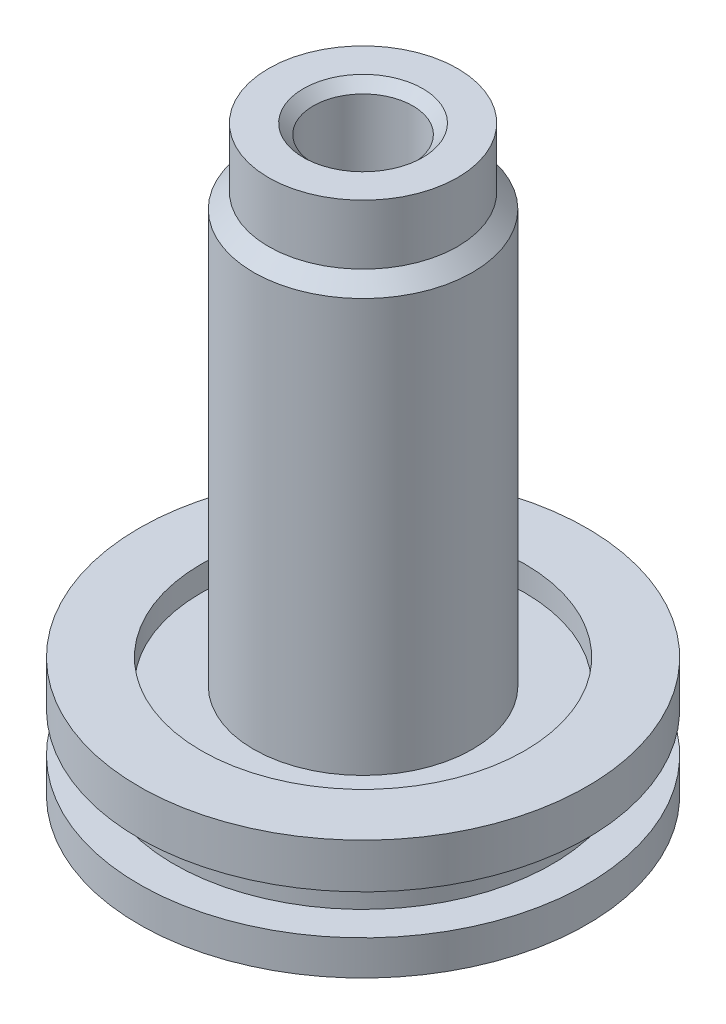
ISO-10303-21;
HEADER;
FILE_DESCRIPTION(('STEP AP214'),'2;1');
FILE_NAME('part.step','',(''),(''),'','','');
FILE_SCHEMA(('AUTOMOTIVE_DESIGN { 1 0 10303 214 1 1 1 1 }'));
ENDSEC;
DATA;
#1=APPLICATION_CONTEXT('core data for automotive mechanical design processes');
#2=APPLICATION_PROTOCOL_DEFINITION('international standard','automotive_design',2000,#1);
#3=PRODUCT_CONTEXT('',#1,'mechanical');
#4=PRODUCT('Part','Part','',(#3));
#5=PRODUCT_RELATED_PRODUCT_CATEGORY('part','',(#4));
#6=PRODUCT_DEFINITION_FORMATION('','',#4);
#7=PRODUCT_DEFINITION_CONTEXT('part definition',#1,'design');
#8=PRODUCT_DEFINITION('design','',#6,#7);
#9=PRODUCT_DEFINITION_SHAPE('','',#8);
#10=(LENGTH_UNIT() NAMED_UNIT(*) SI_UNIT(.MILLI.,.METRE.));
#11=(NAMED_UNIT(*) PLANE_ANGLE_UNIT() SI_UNIT($,.RADIAN.));
#12=(NAMED_UNIT(*) SI_UNIT($,.STERADIAN.) SOLID_ANGLE_UNIT());
#13=UNCERTAINTY_MEASURE_WITH_UNIT(LENGTH_MEASURE(1.E-05),#10,'distance_accuracy_value','');
#14=(GEOMETRIC_REPRESENTATION_CONTEXT(3) GLOBAL_UNCERTAINTY_ASSIGNED_CONTEXT((#13)) GLOBAL_UNIT_ASSIGNED_CONTEXT((#10,
#11,#12)) REPRESENTATION_CONTEXT('',''));
#15=CARTESIAN_POINT('',(0.,0.,0.));
#16=DIRECTION('',(0.,0.,1.));
#17=DIRECTION('',(1.,0.,0.));
#18=AXIS2_PLACEMENT_3D('',#15,#16,#17);
#19=CARTESIAN_POINT('',(-1.51753609678451E-10,0.,0.));
#20=DIRECTION('',(0.,1.,0.));
#21=DIRECTION('',(-1.,0.,0.));
#22=AXIS2_PLACEMENT_3D('',#19,#20,#21);
#23=CYLINDRICAL_SURFACE('',#22,22.0000000001518);
#24=CARTESIAN_POINT('',(-1.51753609678451E-10,0.,0.));
#25=DIRECTION('',(0.,1.,0.));
#26=DIRECTION('',(-1.,0.,0.));
#27=AXIS2_PLACEMENT_3D('',#24,#25,#26);
#28=CIRCLE('',#27,22.0000000001518);
#29=CARTESIAN_POINT('',(-22.0000000003035,0.,0.));
#30=VERTEX_POINT('',#29);
#31=EDGE_CURVE('E11',#30,#30,#28,.T.);
#32=ORIENTED_EDGE('',*,*,#31,.T.);
#33=EDGE_LOOP('',(#32));
#34=FACE_BOUND('',#33,.T.);
#35=CARTESIAN_POINT('',(-1.51753637434027E-10,8.,0.));
#36=DIRECTION('',(0.,1.,0.));
#37=DIRECTION('',(-1.,0.,0.));
#38=AXIS2_PLACEMENT_3D('',#35,#36,#37);
#39=CIRCLE('',#38,22.0000000001518);
#40=CARTESIAN_POINT('',(-22.0000000003035,8.,0.));
#41=VERTEX_POINT('',#40);
#42=EDGE_CURVE('E65',#41,#41,#39,.T.);
#43=ORIENTED_EDGE('',*,*,#42,.F.);
#44=EDGE_LOOP('',(#43));
#45=FACE_BOUND('',#44,.T.);
#46=ADVANCED_FACE('F33',(#34,#45),#23,.T.);
#47=CARTESIAN_POINT('',(22.,0.,0.));
#48=DIRECTION('',(0.,-1.,0.));
#49=DIRECTION('',(1.,0.,0.));
#50=AXIS2_PLACEMENT_3D('',#47,#48,#49);
#51=PLANE('',#50);
#52=ORIENTED_EDGE('',*,*,#31,.F.);
#53=EDGE_LOOP('',(#52));
#54=FACE_BOUND('',#53,.T.);
#55=ADVANCED_FACE('F45',(#54),#51,.T.);
#56=CARTESIAN_POINT('',(-1.51753679316485E-10,20.0717967696369,0.));
#57=DIRECTION('',(0.,1.,0.));
#58=DIRECTION('',(-1.,0.,0.));
#59=AXIS2_PLACEMENT_3D('',#56,#57,#58);
#60=CONICAL_SURFACE('',#59,0.,1.0471975511966);
#61=CARTESIAN_POINT('',(-1.51753703353519E-10,27.,0.));
#62=DIRECTION('',(0.,1.,0.));
#63=DIRECTION('',(-1.,0.,0.));
#64=AXIS2_PLACEMENT_3D('',#61,#62,#63);
#65=CIRCLE('',#64,12.0000000001518);
#66=CARTESIAN_POINT('',(-12.0000000003035,27.,0.));
#67=VERTEX_POINT('',#66);
#68=EDGE_CURVE('E39',#67,#67,#65,.T.);
#69=ORIENTED_EDGE('',*,*,#68,.T.);
#70=EDGE_LOOP('',(#69));
#71=FACE_BOUND('',#70,.T.);
#72=CARTESIAN_POINT('',(-1.5175404335932E-10,20.0717967696369,0.));
#73=VERTEX_POINT('',#72);
#74=VERTEX_LOOP('',#73);
#75=FACE_BOUND('',#74,.T.);
#76=ADVANCED_FACE('F42',(#71,#75),#60,.F.);
#77=CARTESIAN_POINT('',(-1.51753609678451E-10,0.,0.));
#78=DIRECTION('',(0.,1.,0.));
#79=DIRECTION('',(-1.,0.,0.));
#80=AXIS2_PLACEMENT_3D('',#77,#78,#79);
#81=CYLINDRICAL_SURFACE('',#80,12.0000000001518);
#82=CARTESIAN_POINT('',(-1.51753814375821E-10,58.9999999999999,0.));
#83=DIRECTION('',(0.,1.,0.));
#84=DIRECTION('',(-1.,0.,0.));
#85=AXIS2_PLACEMENT_3D('',#82,#83,#84);
#86=CIRCLE('',#85,12.0000000001518);
#87=CARTESIAN_POINT('',(-12.0000000003035,58.9999999999999,0.));
#88=VERTEX_POINT('',#87);
#89=EDGE_CURVE('E114',#88,#88,#86,.T.);
#90=ORIENTED_EDGE('',*,*,#89,.T.);
#91=EDGE_LOOP('',(#90));
#92=FACE_BOUND('',#91,.T.);
#93=ORIENTED_EDGE('',*,*,#68,.F.);
#94=EDGE_LOOP('',(#93));
#95=FACE_BOUND('',#94,.T.);
#96=ADVANCED_FACE('F44',(#92,#95),#81,.F.);
#97=CARTESIAN_POINT('',(12.,58.9999999999999,0.));
#98=DIRECTION('',(0.,-1.,0.));
#99=DIRECTION('',(1.,0.,0.));
#100=AXIS2_PLACEMENT_3D('',#97,#98,#99);
#101=PLANE('',#100);
#102=CARTESIAN_POINT('',(-1.51753814375821E-10,58.9999999999999,0.));
#103=DIRECTION('',(0.,1.,0.));
#104=DIRECTION('',(-1.,0.,0.));
#105=AXIS2_PLACEMENT_3D('',#102,#103,#104);
#106=CIRCLE('',#105,10.0000000001518);
#107=CARTESIAN_POINT('',(-10.0000000003035,58.9999999999999,0.));
#108=VERTEX_POINT('',#107);
#109=EDGE_CURVE('E111',#108,#108,#106,.T.);
#110=ORIENTED_EDGE('',*,*,#109,.T.);
#111=EDGE_LOOP('',(#110));
#112=FACE_BOUND('',#111,.T.);
#113=ORIENTED_EDGE('',*,*,#89,.F.);
#114=EDGE_LOOP('',(#113));
#115=FACE_BOUND('',#114,.T.);
#116=ADVANCED_FACE('F52',(#112,#115),#101,.T.);
#117=CARTESIAN_POINT('',(-1.51753609678451E-10,0.,0.));
#118=DIRECTION('',(0.,1.,0.));
#119=DIRECTION('',(-1.,0.,0.));
#120=AXIS2_PLACEMENT_3D('',#117,#118,#119);
#121=CYLINDRICAL_SURFACE('',#120,10.0000000001518);
#122=CARTESIAN_POINT('',(-1.51754036420426E-10,123.,0.));
#123=DIRECTION('',(0.,1.,0.));
#124=DIRECTION('',(-1.,0.,0.));
#125=AXIS2_PLACEMENT_3D('',#122,#123,#124);
#126=CIRCLE('',#125,10.0000000001518);
#127=CARTESIAN_POINT('',(-10.0000000003035,123.,0.));
#128=VERTEX_POINT('',#127);
#129=EDGE_CURVE('E108',#128,#128,#126,.T.);
#130=ORIENTED_EDGE('',*,*,#129,.T.);
#131=EDGE_LOOP('',(#130));
#132=FACE_BOUND('',#131,.T.);
#133=ORIENTED_EDGE('',*,*,#109,.F.);
#134=EDGE_LOOP('',(#133));
#135=FACE_BOUND('',#134,.T.);
#136=ADVANCED_FACE('F121',(#132,#135),#121,.F.);
#137=CARTESIAN_POINT('',(-1.51754036420426E-10,123.,0.));
#138=DIRECTION('',(0.,1.,0.));
#139=DIRECTION('',(-1.,0.,0.));
#140=AXIS2_PLACEMENT_3D('',#137,#138,#139);
#141=CONICAL_SURFACE('',#140,10.0000000001518,0.785398163397448);
#142=CARTESIAN_POINT('',(-1.5175404335932E-10,125.,0.));
#143=DIRECTION('',(0.,1.,0.));
#144=DIRECTION('',(-1.,0.,0.));
#145=AXIS2_PLACEMENT_3D('',#142,#143,#144);
#146=CIRCLE('',#145,12.0000000001518);
#147=CARTESIAN_POINT('',(-12.0000000003035,125.,0.));
#148=VERTEX_POINT('',#147);
#149=EDGE_CURVE('E105',#148,#148,#146,.T.);
#150=ORIENTED_EDGE('',*,*,#149,.T.);
#151=EDGE_LOOP('',(#150));
#152=FACE_BOUND('',#151,.T.);
#153=ORIENTED_EDGE('',*,*,#129,.F.);
#154=EDGE_LOOP('',(#153));
#155=FACE_BOUND('',#154,.T.);
#156=ADVANCED_FACE('F127',(#152,#155),#141,.F.);
#157=CARTESIAN_POINT('',(12.,125.,0.));
#158=DIRECTION('',(0.,1.,0.));
#159=DIRECTION('',(-1.,0.,0.));
#160=AXIS2_PLACEMENT_3D('',#157,#158,#159);
#161=PLANE('',#160);
#162=CARTESIAN_POINT('',(-1.5175404335932E-10,125.,0.));
#163=DIRECTION('',(0.,1.,0.));
#164=DIRECTION('',(-1.,0.,0.));
#165=AXIS2_PLACEMENT_3D('',#162,#163,#164);
#166=CIRCLE('',#165,19.0000000001518);
#167=CARTESIAN_POINT('',(-19.0000000003035,125.,0.));
#168=VERTEX_POINT('',#167);
#169=EDGE_CURVE('E102',#168,#168,#166,.T.);
#170=ORIENTED_EDGE('',*,*,#169,.T.);
#171=EDGE_LOOP('',(#170));
#172=FACE_BOUND('',#171,.T.);
#173=ORIENTED_EDGE('',*,*,#149,.F.);
#174=EDGE_LOOP('',(#173));
#175=FACE_BOUND('',#174,.T.);
#176=ADVANCED_FACE('F133',(#172,#175),#161,.T.);
#177=CARTESIAN_POINT('',(-1.51753609678451E-10,0.,0.));
#178=DIRECTION('',(0.,1.,0.));
#179=DIRECTION('',(-1.,0.,0.));
#180=AXIS2_PLACEMENT_3D('',#177,#178,#179);
#181=CYLINDRICAL_SURFACE('',#180,19.0000000001518);
#182=CARTESIAN_POINT('',(-1.51754001725957E-10,113.,0.));
#183=DIRECTION('',(0.,1.,0.));
#184=DIRECTION('',(-1.,0.,0.));
#185=AXIS2_PLACEMENT_3D('',#182,#183,#184);
#186=CIRCLE('',#185,19.0000000001518);
#187=CARTESIAN_POINT('',(-19.0000000003035,113.,0.));
#188=VERTEX_POINT('',#187);
#189=EDGE_CURVE('E99',#188,#188,#186,.T.);
#190=ORIENTED_EDGE('',*,*,#189,.T.);
#191=EDGE_LOOP('',(#190));
#192=FACE_BOUND('',#191,.T.);
#193=ORIENTED_EDGE('',*,*,#169,.F.);
#194=EDGE_LOOP('',(#193));
#195=FACE_BOUND('',#194,.T.);
#196=ADVANCED_FACE('F137',(#192,#195),#181,.T.);
#197=CARTESIAN_POINT('',(-1.51754001725957E-10,113.,0.));
#198=DIRECTION('',(0.,-1.,0.));
#199=DIRECTION('',(1.,0.,0.));
#200=AXIS2_PLACEMENT_3D('',#197,#198,#199);
#201=CONICAL_SURFACE('',#200,19.0000000001518,0.785398163397447);
#202=CARTESIAN_POINT('',(-1.51753991317616E-10,110.,0.));
#203=DIRECTION('',(0.,1.,0.));
#204=DIRECTION('',(-1.,0.,0.));
#205=AXIS2_PLACEMENT_3D('',#202,#203,#204);
#206=CIRCLE('',#205,22.0000000001518);
#207=CARTESIAN_POINT('',(-22.0000000003035,110.,0.));
#208=VERTEX_POINT('',#207);
#209=EDGE_CURVE('E96',#208,#208,#206,.T.);
#210=ORIENTED_EDGE('',*,*,#209,.T.);
#211=EDGE_LOOP('',(#210));
#212=FACE_BOUND('',#211,.T.);
#213=ORIENTED_EDGE('',*,*,#189,.F.);
#214=EDGE_LOOP('',(#213));
#215=FACE_BOUND('',#214,.T.);
#216=ADVANCED_FACE('F141',(#212,#215),#201,.T.);
#217=CARTESIAN_POINT('',(-1.51753609678451E-10,0.,0.));
#218=DIRECTION('',(0.,1.,0.));
#219=DIRECTION('',(-1.,0.,0.));
#220=AXIS2_PLACEMENT_3D('',#217,#218,#219);
#221=CYLINDRICAL_SURFACE('',#220,22.0000000001518);
#222=CARTESIAN_POINT('',(-1.51753703353519E-10,27.,0.));
#223=DIRECTION('',(0.,1.,0.));
#224=DIRECTION('',(-1.,0.,0.));
#225=AXIS2_PLACEMENT_3D('',#222,#223,#224);
#226=CIRCLE('',#225,22.0000000001518);
#227=CARTESIAN_POINT('',(-22.0000000003035,27.,0.));
#228=VERTEX_POINT('',#227);
#229=EDGE_CURVE('E93',#228,#228,#226,.T.);
#230=ORIENTED_EDGE('',*,*,#229,.T.);
#231=EDGE_LOOP('',(#230));
#232=FACE_BOUND('',#231,.T.);
#233=ORIENTED_EDGE('',*,*,#209,.F.);
#234=EDGE_LOOP('',(#233));
#235=FACE_BOUND('',#234,.T.);
#236=ADVANCED_FACE('F145',(#232,#235),#221,.T.);
#237=CARTESIAN_POINT('',(22.,27.,0.));
#238=DIRECTION('',(0.,1.,0.));
#239=DIRECTION('',(-1.,0.,0.));
#240=AXIS2_PLACEMENT_3D('',#237,#238,#239);
#241=PLANE('',#240);
#242=CARTESIAN_POINT('',(-1.51753703353519E-10,27.,0.));
#243=DIRECTION('',(0.,1.,0.));
#244=DIRECTION('',(-1.,0.,0.));
#245=AXIS2_PLACEMENT_3D('',#242,#243,#244);
#246=CIRCLE('',#245,32.5000000001518);
#247=CARTESIAN_POINT('',(-32.5000000003035,27.,0.));
#248=VERTEX_POINT('',#247);
#249=EDGE_CURVE('E90',#248,#248,#246,.T.);
#250=ORIENTED_EDGE('',*,*,#249,.T.);
#251=EDGE_LOOP('',(#250));
#252=FACE_BOUND('',#251,.T.);
#253=ORIENTED_EDGE('',*,*,#229,.F.);
#254=EDGE_LOOP('',(#253));
#255=FACE_BOUND('',#254,.T.);
#256=ADVANCED_FACE('F149',(#252,#255),#241,.T.);
#257=CARTESIAN_POINT('',(-1.51753609678451E-10,0.,0.));
#258=DIRECTION('',(0.,1.,0.));
#259=DIRECTION('',(-1.,0.,0.));
#260=AXIS2_PLACEMENT_3D('',#257,#258,#259);
#261=CYLINDRICAL_SURFACE('',#260,32.5000000001518);
#262=CARTESIAN_POINT('',(-1.51753720700754E-10,32.,0.));
#263=DIRECTION('',(0.,1.,0.));
#264=DIRECTION('',(-1.,0.,0.));
#265=AXIS2_PLACEMENT_3D('',#262,#263,#264);
#266=CIRCLE('',#265,32.5000000001518);
#267=CARTESIAN_POINT('',(-32.5000000003035,32.,0.));
#268=VERTEX_POINT('',#267);
#269=EDGE_CURVE('E87',#268,#268,#266,.T.);
#270=ORIENTED_EDGE('',*,*,#269,.T.);
#271=EDGE_LOOP('',(#270));
#272=FACE_BOUND('',#271,.T.);
#273=ORIENTED_EDGE('',*,*,#249,.F.);
#274=EDGE_LOOP('',(#273));
#275=FACE_BOUND('',#274,.T.);
#276=ADVANCED_FACE('F153',(#272,#275),#261,.F.);
#277=CARTESIAN_POINT('',(32.5,32.,0.));
#278=DIRECTION('',(0.,1.,0.));
#279=DIRECTION('',(-1.,0.,0.));
#280=AXIS2_PLACEMENT_3D('',#277,#278,#279);
#281=PLANE('',#280);
#282=CARTESIAN_POINT('',(-1.51753720700754E-10,32.,0.));
#283=DIRECTION('',(0.,1.,0.));
#284=DIRECTION('',(-1.,0.,0.));
#285=AXIS2_PLACEMENT_3D('',#282,#283,#284);
#286=CIRCLE('',#285,45.0000000001518);
#287=CARTESIAN_POINT('',(-45.0000000003035,32.,0.));
#288=VERTEX_POINT('',#287);
#289=EDGE_CURVE('E84',#288,#288,#286,.T.);
#290=ORIENTED_EDGE('',*,*,#289,.T.);
#291=EDGE_LOOP('',(#290));
#292=FACE_BOUND('',#291,.T.);
#293=ORIENTED_EDGE('',*,*,#269,.F.);
#294=EDGE_LOOP('',(#293));
#295=FACE_BOUND('',#294,.T.);
#296=ADVANCED_FACE('F157',(#292,#295),#281,.T.);
#297=CARTESIAN_POINT('',(-1.51753609678451E-10,0.,0.));
#298=DIRECTION('',(0.,1.,0.));
#299=DIRECTION('',(-1.,0.,0.));
#300=AXIS2_PLACEMENT_3D('',#297,#298,#299);
#301=CYLINDRICAL_SURFACE('',#300,45.0000000001518);
#302=CARTESIAN_POINT('',(-1.51753689475731E-10,23.,0.));
#303=DIRECTION('',(0.,1.,0.));
#304=DIRECTION('',(-1.,0.,0.));
#305=AXIS2_PLACEMENT_3D('',#302,#303,#304);
#306=CIRCLE('',#305,45.0000000001518);
#307=CARTESIAN_POINT('',(-45.0000000003035,23.,0.));
#308=VERTEX_POINT('',#307);
#309=EDGE_CURVE('E81',#308,#308,#306,.T.);
#310=ORIENTED_EDGE('',*,*,#309,.T.);
#311=EDGE_LOOP('',(#310));
#312=FACE_BOUND('',#311,.T.);
#313=ORIENTED_EDGE('',*,*,#289,.F.);
#314=EDGE_LOOP('',(#313));
#315=FACE_BOUND('',#314,.T.);
#316=ADVANCED_FACE('F161',(#312,#315),#301,.T.);
#317=CARTESIAN_POINT('',(45.,23.,0.));
#318=DIRECTION('',(0.,-1.,0.));
#319=DIRECTION('',(1.,0.,0.));
#320=AXIS2_PLACEMENT_3D('',#317,#318,#319);
#321=PLANE('',#320);
#322=CARTESIAN_POINT('',(-1.51753689475731E-10,23.,0.));
#323=DIRECTION('',(0.,1.,0.));
#324=DIRECTION('',(-1.,0.,0.));
#325=AXIS2_PLACEMENT_3D('',#322,#323,#324);
#326=CIRCLE('',#325,38.0000000001518);
#327=CARTESIAN_POINT('',(-38.0000000003035,23.,0.));
#328=VERTEX_POINT('',#327);
#329=EDGE_CURVE('E78',#328,#328,#326,.T.);
#330=ORIENTED_EDGE('',*,*,#329,.T.);
#331=EDGE_LOOP('',(#330));
#332=FACE_BOUND('',#331,.T.);
#333=ORIENTED_EDGE('',*,*,#309,.F.);
#334=EDGE_LOOP('',(#333));
#335=FACE_BOUND('',#334,.T.);
#336=ADVANCED_FACE('F165',(#332,#335),#321,.T.);
#337=CARTESIAN_POINT('',(-1.51753609678451E-10,0.,0.));
#338=DIRECTION('',(0.,1.,0.));
#339=DIRECTION('',(-1.,0.,0.));
#340=AXIS2_PLACEMENT_3D('',#337,#338,#339);
#341=CYLINDRICAL_SURFACE('',#340,38.0000000001518);
#342=CARTESIAN_POINT('',(-1.51753661720155E-10,15.,0.));
#343=DIRECTION('',(0.,1.,0.));
#344=DIRECTION('',(-1.,0.,0.));
#345=AXIS2_PLACEMENT_3D('',#342,#343,#344);
#346=CIRCLE('',#345,38.0000000001518);
#347=CARTESIAN_POINT('',(-38.0000000003035,15.,0.));
#348=VERTEX_POINT('',#347);
#349=EDGE_CURVE('E75',#348,#348,#346,.T.);
#350=ORIENTED_EDGE('',*,*,#349,.T.);
#351=EDGE_LOOP('',(#350));
#352=FACE_BOUND('',#351,.T.);
#353=ORIENTED_EDGE('',*,*,#329,.F.);
#354=EDGE_LOOP('',(#353));
#355=FACE_BOUND('',#354,.T.);
#356=ADVANCED_FACE('F169',(#352,#355),#341,.T.);
#357=CARTESIAN_POINT('',(38.,15.,0.));
#358=DIRECTION('',(0.,1.,0.));
#359=DIRECTION('',(-1.,0.,0.));
#360=AXIS2_PLACEMENT_3D('',#357,#358,#359);
#361=PLANE('',#360);
#362=CARTESIAN_POINT('',(-1.51753661720155E-10,15.,0.));
#363=DIRECTION('',(0.,1.,0.));
#364=DIRECTION('',(-1.,0.,0.));
#365=AXIS2_PLACEMENT_3D('',#362,#363,#364);
#366=CIRCLE('',#365,45.0000000001518);
#367=CARTESIAN_POINT('',(-45.0000000003035,15.,0.));
#368=VERTEX_POINT('',#367);
#369=EDGE_CURVE('E70',#368,#368,#366,.T.);
#370=ORIENTED_EDGE('',*,*,#369,.T.);
#371=EDGE_LOOP('',(#370));
#372=FACE_BOUND('',#371,.T.);
#373=ORIENTED_EDGE('',*,*,#349,.F.);
#374=EDGE_LOOP('',(#373));
#375=FACE_BOUND('',#374,.T.);
#376=ADVANCED_FACE('F173',(#372,#375),#361,.T.);
#377=CARTESIAN_POINT('',(-1.51753609678451E-10,0.,0.));
#378=DIRECTION('',(0.,1.,0.));
#379=DIRECTION('',(-1.,0.,0.));
#380=AXIS2_PLACEMENT_3D('',#377,#378,#379);
#381=CYLINDRICAL_SURFACE('',#380,45.0000000001518);
#382=CARTESIAN_POINT('',(-1.51753637434027E-10,8.,0.));
#383=DIRECTION('',(0.,1.,0.));
#384=DIRECTION('',(-1.,0.,0.));
#385=AXIS2_PLACEMENT_3D('',#382,#383,#384);
#386=CIRCLE('',#385,45.0000000001518);
#387=CARTESIAN_POINT('',(-45.0000000003035,8.,0.));
#388=VERTEX_POINT('',#387);
#389=EDGE_CURVE('E67',#388,#388,#386,.T.);
#390=ORIENTED_EDGE('',*,*,#389,.T.);
#391=EDGE_LOOP('',(#390));
#392=FACE_BOUND('',#391,.T.);
#393=ORIENTED_EDGE('',*,*,#369,.F.);
#394=EDGE_LOOP('',(#393));
#395=FACE_BOUND('',#394,.T.);
#396=ADVANCED_FACE('F177',(#392,#395),#381,.T.);
#397=CARTESIAN_POINT('',(45.,8.,0.));
#398=DIRECTION('',(0.,-1.,0.));
#399=DIRECTION('',(1.,0.,0.));
#400=AXIS2_PLACEMENT_3D('',#397,#398,#399);
#401=PLANE('',#400);
#402=ORIENTED_EDGE('',*,*,#42,.T.);
#403=EDGE_LOOP('',(#402));
#404=FACE_BOUND('',#403,.T.);
#405=ORIENTED_EDGE('',*,*,#389,.F.);
#406=EDGE_LOOP('',(#405));
#407=FACE_BOUND('',#406,.T.);
#408=ADVANCED_FACE('F181',(#404,#407),#401,.T.);
#409=CLOSED_SHELL('',(#46,#55,#76,#96,#116,#136,#156,#176,#196,#216,#236,#256,#276,#296,#316,
#336,#356,#376,#396,#408));
#410=MANIFOLD_SOLID_BREP('B2',#409);
#411=ADVANCED_BREP_SHAPE_REPRESENTATION('',(#18,#410),#14);
#412=SHAPE_DEFINITION_REPRESENTATION(#9,#411);
ENDSEC;
END-ISO-10303-21;
